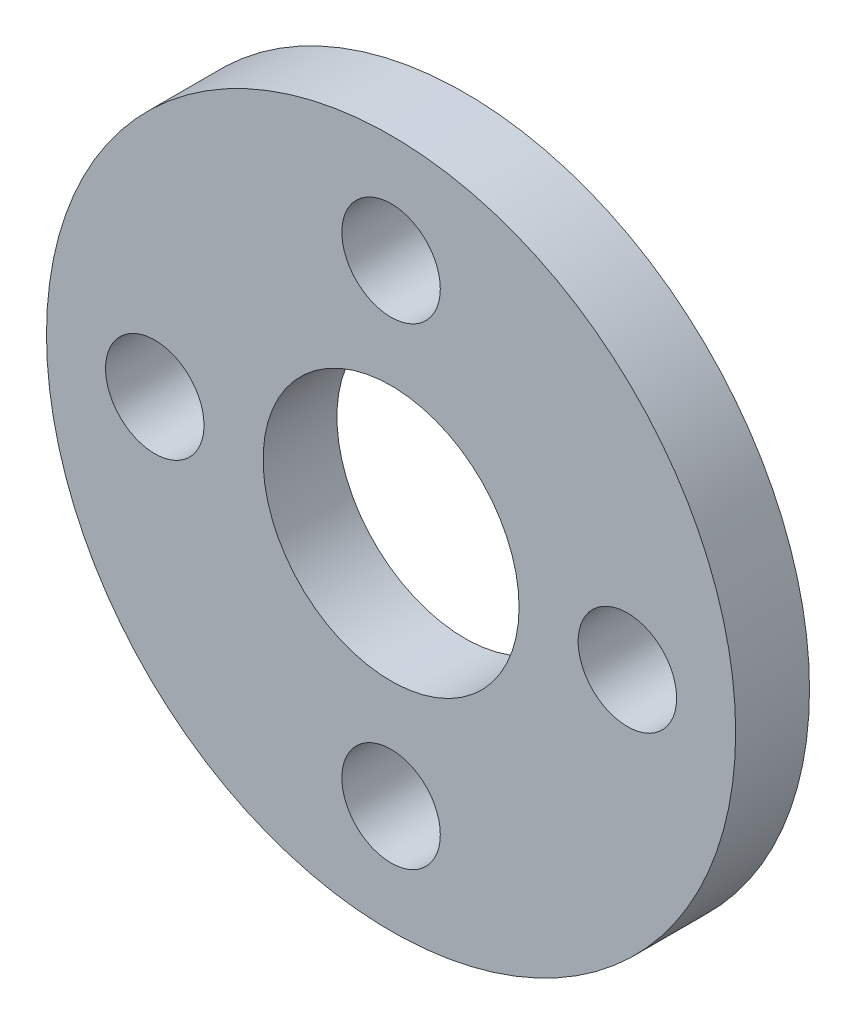
ISO-10303-21;
HEADER;
FILE_DESCRIPTION(('STEP AP214'),'2;1');
FILE_NAME('part.step','',(''),(''),'','','');
FILE_SCHEMA(('AUTOMOTIVE_DESIGN { 1 0 10303 214 1 1 1 1 }'));
ENDSEC;
DATA;
#1=APPLICATION_CONTEXT('core data for automotive mechanical design processes');
#2=APPLICATION_PROTOCOL_DEFINITION('international standard','automotive_design',2000,#1);
#3=PRODUCT_CONTEXT('',#1,'mechanical');
#4=PRODUCT('Part','Part','',(#3));
#5=PRODUCT_RELATED_PRODUCT_CATEGORY('part','',(#4));
#6=PRODUCT_DEFINITION_FORMATION('','',#4);
#7=PRODUCT_DEFINITION_CONTEXT('part definition',#1,'design');
#8=PRODUCT_DEFINITION('design','',#6,#7);
#9=PRODUCT_DEFINITION_SHAPE('','',#8);
#10=(LENGTH_UNIT() NAMED_UNIT(*) SI_UNIT(.MILLI.,.METRE.));
#11=(NAMED_UNIT(*) PLANE_ANGLE_UNIT() SI_UNIT($,.RADIAN.));
#12=(NAMED_UNIT(*) SI_UNIT($,.STERADIAN.) SOLID_ANGLE_UNIT());
#13=UNCERTAINTY_MEASURE_WITH_UNIT(LENGTH_MEASURE(1.E-05),#10,'distance_accuracy_value','');
#14=(GEOMETRIC_REPRESENTATION_CONTEXT(3) GLOBAL_UNCERTAINTY_ASSIGNED_CONTEXT((#13)) GLOBAL_UNIT_ASSIGNED_CONTEXT((#10,
#11,#12)) REPRESENTATION_CONTEXT('',''));
#15=CARTESIAN_POINT('',(0.,0.,0.));
#16=DIRECTION('',(0.,0.,1.));
#17=DIRECTION('',(1.,0.,0.));
#18=AXIS2_PLACEMENT_3D('',#15,#16,#17);
#19=CARTESIAN_POINT('',(0.,0.,1.5));
#20=DIRECTION('',(0.,0.,1.));
#21=DIRECTION('',(1.,0.,0.));
#22=AXIS2_PLACEMENT_3D('',#19,#20,#21);
#23=PLANE('',#22);
#24=CARTESIAN_POINT('',(4.8,0.,1.5));
#25=DIRECTION('',(0.,0.,1.));
#26=DIRECTION('',(1.,0.,0.));
#27=AXIS2_PLACEMENT_3D('',#24,#25,#26);
#28=CIRCLE('',#27,1.);
#29=CARTESIAN_POINT('',(5.8,0.,1.5));
#30=VERTEX_POINT('',#29);
#31=EDGE_CURVE('E61',#30,#30,#28,.T.);
#32=ORIENTED_EDGE('',*,*,#31,.F.);
#33=EDGE_LOOP('',(#32));
#34=FACE_BOUND('',#33,.T.);
#35=CARTESIAN_POINT('',(-4.8,0.,1.5));
#36=DIRECTION('',(0.,0.,1.));
#37=DIRECTION('',(1.,0.,0.));
#38=AXIS2_PLACEMENT_3D('',#35,#36,#37);
#39=CIRCLE('',#38,1.);
#40=CARTESIAN_POINT('',(-3.8,0.,1.5));
#41=VERTEX_POINT('',#40);
#42=EDGE_CURVE('E49',#41,#41,#39,.T.);
#43=ORIENTED_EDGE('',*,*,#42,.F.);
#44=EDGE_LOOP('',(#43));
#45=FACE_BOUND('',#44,.T.);
#46=CARTESIAN_POINT('',(0.,0.,1.5));
#47=DIRECTION('',(0.,0.,1.));
#48=DIRECTION('',(1.,0.,0.));
#49=AXIS2_PLACEMENT_3D('',#46,#47,#48);
#50=CIRCLE('',#49,7.);
#51=CARTESIAN_POINT('',(7.,0.,1.5));
#52=VERTEX_POINT('',#51);
#53=EDGE_CURVE('E10',#52,#52,#50,.T.);
#54=ORIENTED_EDGE('',*,*,#53,.T.);
#55=EDGE_LOOP('',(#54));
#56=FACE_BOUND('',#55,.T.);
#57=CARTESIAN_POINT('',(0.,0.,1.5));
#58=DIRECTION('',(0.,0.,1.));
#59=DIRECTION('',(1.,0.,0.));
#60=AXIS2_PLACEMENT_3D('',#57,#58,#59);
#61=CIRCLE('',#60,2.6);
#62=CARTESIAN_POINT('',(2.6,0.,1.5));
#63=VERTEX_POINT('',#62);
#64=EDGE_CURVE('E44',#63,#63,#61,.T.);
#65=ORIENTED_EDGE('',*,*,#64,.F.);
#66=EDGE_LOOP('',(#65));
#67=FACE_BOUND('',#66,.T.);
#68=CARTESIAN_POINT('',(0.,4.8,1.5));
#69=DIRECTION('',(0.,0.,1.));
#70=DIRECTION('',(1.,0.,0.));
#71=AXIS2_PLACEMENT_3D('',#68,#69,#70);
#72=CIRCLE('',#71,1.);
#73=CARTESIAN_POINT('',(1.00000000000002,4.8,1.5));
#74=VERTEX_POINT('',#73);
#75=EDGE_CURVE('E55',#74,#74,#72,.T.);
#76=ORIENTED_EDGE('',*,*,#75,.F.);
#77=EDGE_LOOP('',(#76));
#78=FACE_BOUND('',#77,.T.);
#79=CARTESIAN_POINT('',(0.,-4.8,1.5));
#80=DIRECTION('',(0.,0.,1.));
#81=DIRECTION('',(1.,0.,0.));
#82=AXIS2_PLACEMENT_3D('',#79,#80,#81);
#83=CIRCLE('',#82,1.);
#84=CARTESIAN_POINT('',(0.999999999999951,-4.8,1.5));
#85=VERTEX_POINT('',#84);
#86=EDGE_CURVE('E67',#85,#85,#83,.T.);
#87=ORIENTED_EDGE('',*,*,#86,.F.);
#88=EDGE_LOOP('',(#87));
#89=FACE_BOUND('',#88,.T.);
#90=ADVANCED_FACE('F33',(#34,#45,#56,#67,#78,#89),#23,.T.);
#91=CARTESIAN_POINT('',(0.,0.,0.));
#92=DIRECTION('',(0.,0.,1.));
#93=DIRECTION('',(1.,0.,0.));
#94=AXIS2_PLACEMENT_3D('',#91,#92,#93);
#95=PLANE('',#94);
#96=CARTESIAN_POINT('',(0.,0.,0.));
#97=DIRECTION('',(0.,0.,1.));
#98=DIRECTION('',(1.,0.,0.));
#99=AXIS2_PLACEMENT_3D('',#96,#97,#98);
#100=CIRCLE('',#99,7.);
#101=CARTESIAN_POINT('',(7.,0.,0.));
#102=VERTEX_POINT('',#101);
#103=EDGE_CURVE('E37',#102,#102,#100,.T.);
#104=ORIENTED_EDGE('',*,*,#103,.F.);
#105=EDGE_LOOP('',(#104));
#106=FACE_BOUND('',#105,.T.);
#107=CARTESIAN_POINT('',(0.,0.,0.));
#108=DIRECTION('',(0.,0.,1.));
#109=DIRECTION('',(1.,0.,0.));
#110=AXIS2_PLACEMENT_3D('',#107,#108,#109);
#111=CIRCLE('',#110,2.6);
#112=CARTESIAN_POINT('',(2.6,0.,0.));
#113=VERTEX_POINT('',#112);
#114=EDGE_CURVE('E46',#113,#113,#111,.T.);
#115=ORIENTED_EDGE('',*,*,#114,.T.);
#116=EDGE_LOOP('',(#115));
#117=FACE_BOUND('',#116,.T.);
#118=CARTESIAN_POINT('',(-4.8,0.,0.));
#119=DIRECTION('',(0.,0.,1.));
#120=DIRECTION('',(1.,0.,0.));
#121=AXIS2_PLACEMENT_3D('',#118,#119,#120);
#122=CIRCLE('',#121,1.);
#123=CARTESIAN_POINT('',(-3.8,0.,0.));
#124=VERTEX_POINT('',#123);
#125=EDGE_CURVE('E52',#124,#124,#122,.T.);
#126=ORIENTED_EDGE('',*,*,#125,.T.);
#127=EDGE_LOOP('',(#126));
#128=FACE_BOUND('',#127,.T.);
#129=CARTESIAN_POINT('',(0.,4.8,0.));
#130=DIRECTION('',(0.,0.,1.));
#131=DIRECTION('',(1.,0.,0.));
#132=AXIS2_PLACEMENT_3D('',#129,#130,#131);
#133=CIRCLE('',#132,1.);
#134=CARTESIAN_POINT('',(1.00000000000002,4.8,0.));
#135=VERTEX_POINT('',#134);
#136=EDGE_CURVE('E58',#135,#135,#133,.T.);
#137=ORIENTED_EDGE('',*,*,#136,.T.);
#138=EDGE_LOOP('',(#137));
#139=FACE_BOUND('',#138,.T.);
#140=CARTESIAN_POINT('',(4.8,0.,0.));
#141=DIRECTION('',(0.,0.,1.));
#142=DIRECTION('',(1.,0.,0.));
#143=AXIS2_PLACEMENT_3D('',#140,#141,#142);
#144=CIRCLE('',#143,1.);
#145=CARTESIAN_POINT('',(5.8,0.,0.));
#146=VERTEX_POINT('',#145);
#147=EDGE_CURVE('E64',#146,#146,#144,.T.);
#148=ORIENTED_EDGE('',*,*,#147,.T.);
#149=EDGE_LOOP('',(#148));
#150=FACE_BOUND('',#149,.T.);
#151=CARTESIAN_POINT('',(0.,-4.8,0.));
#152=DIRECTION('',(0.,0.,1.));
#153=DIRECTION('',(1.,0.,0.));
#154=AXIS2_PLACEMENT_3D('',#151,#152,#153);
#155=CIRCLE('',#154,1.);
#156=CARTESIAN_POINT('',(0.999999999999951,-4.8,0.));
#157=VERTEX_POINT('',#156);
#158=EDGE_CURVE('E70',#157,#157,#155,.T.);
#159=ORIENTED_EDGE('',*,*,#158,.T.);
#160=EDGE_LOOP('',(#159));
#161=FACE_BOUND('',#160,.T.);
#162=ADVANCED_FACE('F80',(#106,#117,#128,#139,#150,#161),#95,.F.);
#163=CARTESIAN_POINT('',(0.,0.,1.5));
#164=DIRECTION('',(0.,0.,-1.));
#165=DIRECTION('',(-1.,0.,0.));
#166=AXIS2_PLACEMENT_3D('',#163,#164,#165);
#167=CYLINDRICAL_SURFACE('',#166,7.);
#168=ORIENTED_EDGE('',*,*,#53,.F.);
#169=EDGE_LOOP('',(#168));
#170=FACE_BOUND('',#169,.T.);
#171=ORIENTED_EDGE('',*,*,#103,.T.);
#172=EDGE_LOOP('',(#171));
#173=FACE_BOUND('',#172,.T.);
#174=ADVANCED_FACE('F35',(#170,#173),#167,.T.);
#175=CARTESIAN_POINT('',(0.,0.,1.5));
#176=DIRECTION('',(0.,0.,-1.));
#177=DIRECTION('',(-1.,0.,0.));
#178=AXIS2_PLACEMENT_3D('',#175,#176,#177);
#179=CYLINDRICAL_SURFACE('',#178,2.6);
#180=ORIENTED_EDGE('',*,*,#64,.T.);
#181=EDGE_LOOP('',(#180));
#182=FACE_BOUND('',#181,.T.);
#183=ORIENTED_EDGE('',*,*,#114,.F.);
#184=EDGE_LOOP('',(#183));
#185=FACE_BOUND('',#184,.T.);
#186=ADVANCED_FACE('F90',(#182,#185),#179,.F.);
#187=CARTESIAN_POINT('',(-4.8,0.,1.5));
#188=DIRECTION('',(0.,0.,-1.));
#189=DIRECTION('',(-1.,0.,0.));
#190=AXIS2_PLACEMENT_3D('',#187,#188,#189);
#191=CYLINDRICAL_SURFACE('',#190,1.);
#192=ORIENTED_EDGE('',*,*,#42,.T.);
#193=EDGE_LOOP('',(#192));
#194=FACE_BOUND('',#193,.T.);
#195=ORIENTED_EDGE('',*,*,#125,.F.);
#196=EDGE_LOOP('',(#195));
#197=FACE_BOUND('',#196,.T.);
#198=ADVANCED_FACE('F93',(#194,#197),#191,.F.);
#199=CARTESIAN_POINT('',(0.,4.8,1.5));
#200=DIRECTION('',(0.,0.,-1.));
#201=DIRECTION('',(-1.,0.,0.));
#202=AXIS2_PLACEMENT_3D('',#199,#200,#201);
#203=CYLINDRICAL_SURFACE('',#202,1.);
#204=ORIENTED_EDGE('',*,*,#75,.T.);
#205=EDGE_LOOP('',(#204));
#206=FACE_BOUND('',#205,.T.);
#207=ORIENTED_EDGE('',*,*,#136,.F.);
#208=EDGE_LOOP('',(#207));
#209=FACE_BOUND('',#208,.T.);
#210=ADVANCED_FACE('F97',(#206,#209),#203,.F.);
#211=CARTESIAN_POINT('',(4.8,0.,1.5));
#212=DIRECTION('',(0.,0.,-1.));
#213=DIRECTION('',(-1.,0.,0.));
#214=AXIS2_PLACEMENT_3D('',#211,#212,#213);
#215=CYLINDRICAL_SURFACE('',#214,1.);
#216=ORIENTED_EDGE('',*,*,#31,.T.);
#217=EDGE_LOOP('',(#216));
#218=FACE_BOUND('',#217,.T.);
#219=ORIENTED_EDGE('',*,*,#147,.F.);
#220=EDGE_LOOP('',(#219));
#221=FACE_BOUND('',#220,.T.);
#222=ADVANCED_FACE('F101',(#218,#221),#215,.F.);
#223=CARTESIAN_POINT('',(0.,-4.8,1.5));
#224=DIRECTION('',(0.,0.,-1.));
#225=DIRECTION('',(-1.,0.,0.));
#226=AXIS2_PLACEMENT_3D('',#223,#224,#225);
#227=CYLINDRICAL_SURFACE('',#226,1.);
#228=ORIENTED_EDGE('',*,*,#86,.T.);
#229=EDGE_LOOP('',(#228));
#230=FACE_BOUND('',#229,.T.);
#231=ORIENTED_EDGE('',*,*,#158,.F.);
#232=EDGE_LOOP('',(#231));
#233=FACE_BOUND('',#232,.T.);
#234=ADVANCED_FACE('F76',(#230,#233),#227,.F.);
#235=CLOSED_SHELL('',(#90,#162,#174,#186,#198,#210,#222,#234));
#236=MANIFOLD_SOLID_BREP('B2',#235);
#237=ADVANCED_BREP_SHAPE_REPRESENTATION('',(#18,#236),#14);
#238=SHAPE_DEFINITION_REPRESENTATION(#9,#237);
ENDSEC;
END-ISO-10303-21;
